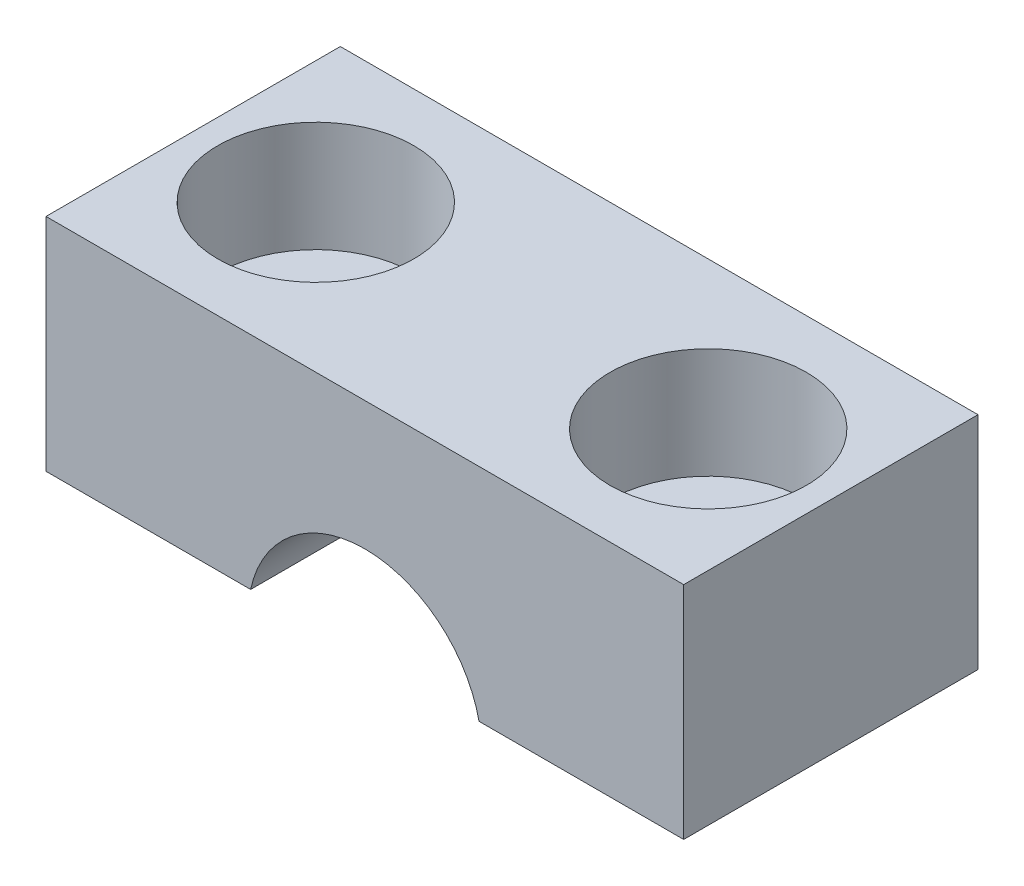
ISO-10303-21;
HEADER;
FILE_DESCRIPTION(('STEP AP214'),'2;1');
FILE_NAME('part.step','',(''),(''),'','','');
FILE_SCHEMA(('AUTOMOTIVE_DESIGN { 1 0 10303 214 1 1 1 1 }'));
ENDSEC;
DATA;
#1=APPLICATION_CONTEXT('core data for automotive mechanical design processes');
#2=APPLICATION_PROTOCOL_DEFINITION('international standard','automotive_design',2000,#1);
#3=PRODUCT_CONTEXT('',#1,'mechanical');
#4=PRODUCT('Part','Part','',(#3));
#5=PRODUCT_RELATED_PRODUCT_CATEGORY('part','',(#4));
#6=PRODUCT_DEFINITION_FORMATION('','',#4);
#7=PRODUCT_DEFINITION_CONTEXT('part definition',#1,'design');
#8=PRODUCT_DEFINITION('design','',#6,#7);
#9=PRODUCT_DEFINITION_SHAPE('','',#8);
#10=(LENGTH_UNIT() NAMED_UNIT(*) SI_UNIT(.MILLI.,.METRE.));
#11=(NAMED_UNIT(*) PLANE_ANGLE_UNIT() SI_UNIT($,.RADIAN.));
#12=(NAMED_UNIT(*) SI_UNIT($,.STERADIAN.) SOLID_ANGLE_UNIT());
#13=UNCERTAINTY_MEASURE_WITH_UNIT(LENGTH_MEASURE(1.E-05),#10,'distance_accuracy_value','');
#14=(GEOMETRIC_REPRESENTATION_CONTEXT(3) GLOBAL_UNCERTAINTY_ASSIGNED_CONTEXT((#13)) GLOBAL_UNIT_ASSIGNED_CONTEXT((#10,
#11,#12)) REPRESENTATION_CONTEXT('',''));
#15=CARTESIAN_POINT('',(0.,0.,0.));
#16=DIRECTION('',(0.,0.,1.));
#17=DIRECTION('',(1.,0.,0.));
#18=AXIS2_PLACEMENT_3D('',#15,#16,#17);
#19=CARTESIAN_POINT('',(0.,26.,0.));
#20=DIRECTION('',(0.,1.,0.));
#21=DIRECTION('',(0.,0.,1.));
#22=AXIS2_PLACEMENT_3D('',#19,#20,#21);
#23=PLANE('',#22);
#24=CARTESIAN_POINT('',(8.,26.,0.));
#25=DIRECTION('',(0.,1.,0.));
#26=DIRECTION('',(0.,0.,1.));
#27=AXIS2_PLACEMENT_3D('',#24,#25,#26);
#28=CIRCLE('',#27,2.25000000000001);
#29=CARTESIAN_POINT('',(8.,26.,2.25000000000001));
#30=VERTEX_POINT('',#29);
#31=EDGE_CURVE('E142',#30,#30,#28,.T.);
#32=ORIENTED_EDGE('',*,*,#31,.T.);
#33=EDGE_LOOP('',(#32));
#34=FACE_BOUND('',#33,.T.);
#35=DIRECTION('',(1.,0.,0.));
#36=VECTOR('',#35,1.);
#37=CARTESIAN_POINT('',(-13.,26.,6.));
#38=LINE('',#37,#36);
#39=CARTESIAN_POINT('',(4.65632969730452,26.,6.));
#40=VERTEX_POINT('',#39);
#41=CARTESIAN_POINT('',(13.,26.,6.));
#42=VERTEX_POINT('',#41);
#43=EDGE_CURVE('E57',#40,#42,#38,.T.);
#44=ORIENTED_EDGE('',*,*,#43,.F.);
#45=DIRECTION('',(0.,0.,-1.));
#46=VECTOR('',#45,1.);
#47=CARTESIAN_POINT('',(4.65632969730452,26.,6.));
#48=LINE('',#47,#46);
#49=CARTESIAN_POINT('',(4.65632969730452,26.,-6.));
#50=VERTEX_POINT('',#49);
#51=EDGE_CURVE('E91',#40,#50,#48,.T.);
#52=ORIENTED_EDGE('',*,*,#51,.T.);
#53=DIRECTION('',(-1.,0.,0.));
#54=VECTOR('',#53,1.);
#55=CARTESIAN_POINT('',(13.,26.,-6.));
#56=LINE('',#55,#54);
#57=CARTESIAN_POINT('',(13.,26.,-6.));
#58=VERTEX_POINT('',#57);
#59=EDGE_CURVE('E109',#58,#50,#56,.T.);
#60=ORIENTED_EDGE('',*,*,#59,.F.);
#61=DIRECTION('',(0.,0.,-1.));
#62=VECTOR('',#61,1.);
#63=CARTESIAN_POINT('',(13.,26.,6.));
#64=LINE('',#63,#62);
#65=EDGE_CURVE('E105',#42,#58,#64,.T.);
#66=ORIENTED_EDGE('',*,*,#65,.F.);
#67=EDGE_LOOP('',(#44,#52,#60,#66));
#68=FACE_BOUND('',#67,.T.);
#69=ADVANCED_FACE('F33',(#34,#68),#23,.F.);
#70=CARTESIAN_POINT('',(13.,26.,6.));
#71=DIRECTION('',(1.,0.,0.));
#72=DIRECTION('',(0.,0.,-1.));
#73=AXIS2_PLACEMENT_3D('',#70,#71,#72);
#74=PLANE('',#73);
#75=DIRECTION('',(0.,0.,-1.));
#76=VECTOR('',#75,1.);
#77=CARTESIAN_POINT('',(13.,35.,6.));
#78=LINE('',#77,#76);
#79=CARTESIAN_POINT('',(13.,35.,6.));
#80=VERTEX_POINT('',#79);
#81=CARTESIAN_POINT('',(13.,35.,-6.));
#82=VERTEX_POINT('',#81);
#83=EDGE_CURVE('E113',#80,#82,#78,.T.);
#84=ORIENTED_EDGE('',*,*,#83,.F.);
#85=DIRECTION('',(0.,1.,0.));
#86=VECTOR('',#85,1.);
#87=CARTESIAN_POINT('',(13.,26.,6.));
#88=LINE('',#87,#86);
#89=EDGE_CURVE('E11',#42,#80,#88,.T.);
#90=ORIENTED_EDGE('',*,*,#89,.F.);
#91=ORIENTED_EDGE('',*,*,#65,.T.);
#92=DIRECTION('',(0.,1.,0.));
#93=VECTOR('',#92,1.);
#94=CARTESIAN_POINT('',(13.,26.,-6.));
#95=LINE('',#94,#93);
#96=EDGE_CURVE('E37',#58,#82,#95,.T.);
#97=ORIENTED_EDGE('',*,*,#96,.T.);
#98=EDGE_LOOP('',(#84,#90,#91,#97));
#99=FACE_BOUND('',#98,.T.);
#100=ADVANCED_FACE('F35',(#99),#74,.T.);
#101=CARTESIAN_POINT('',(-13.,26.,6.));
#102=DIRECTION('',(0.,0.,1.));
#103=DIRECTION('',(1.,0.,0.));
#104=AXIS2_PLACEMENT_3D('',#101,#102,#103);
#105=PLANE('',#104);
#106=CARTESIAN_POINT('',(0.,25.,6.));
#107=DIRECTION('',(0.,0.,-1.));
#108=DIRECTION('',(-1.,0.,0.));
#109=AXIS2_PLACEMENT_3D('',#106,#107,#108);
#110=CIRCLE('',#109,4.7625);
#111=CARTESIAN_POINT('',(-4.65632969730452,26.,6.));
#112=VERTEX_POINT('',#111);
#113=EDGE_CURVE('E50',#112,#40,#110,.T.);
#114=ORIENTED_EDGE('',*,*,#113,.T.);
#115=ORIENTED_EDGE('',*,*,#43,.T.);
#116=ORIENTED_EDGE('',*,*,#89,.T.);
#117=DIRECTION('',(1.,0.,0.));
#118=VECTOR('',#117,1.);
#119=CARTESIAN_POINT('',(-13.,35.,6.));
#120=LINE('',#119,#118);
#121=CARTESIAN_POINT('',(-13.,35.,6.));
#122=VERTEX_POINT('',#121);
#123=EDGE_CURVE('E122',#122,#80,#120,.T.);
#124=ORIENTED_EDGE('',*,*,#123,.F.);
#125=DIRECTION('',(0.,1.,0.));
#126=VECTOR('',#125,1.);
#127=CARTESIAN_POINT('',(-13.,26.,6.));
#128=LINE('',#127,#126);
#129=CARTESIAN_POINT('',(-13.,26.,6.));
#130=VERTEX_POINT('',#129);
#131=EDGE_CURVE('E42',#130,#122,#128,.T.);
#132=ORIENTED_EDGE('',*,*,#131,.F.);
#133=EDGE_CURVE('E101',#130,#112,#38,.T.);
#134=ORIENTED_EDGE('',*,*,#133,.T.);
#135=EDGE_LOOP('',(#114,#115,#116,#124,#132,#134));
#136=FACE_BOUND('',#135,.T.);
#137=ADVANCED_FACE('F99',(#136),#105,.T.);
#138=CARTESIAN_POINT('',(-13.,26.,-6.));
#139=DIRECTION('',(-1.,0.,0.));
#140=DIRECTION('',(0.,0.,1.));
#141=AXIS2_PLACEMENT_3D('',#138,#139,#140);
#142=PLANE('',#141);
#143=DIRECTION('',(0.,0.,1.));
#144=VECTOR('',#143,1.);
#145=CARTESIAN_POINT('',(-13.,35.,-6.));
#146=LINE('',#145,#144);
#147=CARTESIAN_POINT('',(-13.,35.,-6.));
#148=VERTEX_POINT('',#147);
#149=EDGE_CURVE('E119',#148,#122,#146,.T.);
#150=ORIENTED_EDGE('',*,*,#149,.F.);
#151=DIRECTION('',(0.,1.,0.));
#152=VECTOR('',#151,1.);
#153=CARTESIAN_POINT('',(-13.,26.,-6.));
#154=LINE('',#153,#152);
#155=CARTESIAN_POINT('',(-13.,26.,-6.));
#156=VERTEX_POINT('',#155);
#157=EDGE_CURVE('E125',#156,#148,#154,.T.);
#158=ORIENTED_EDGE('',*,*,#157,.F.);
#159=DIRECTION('',(0.,0.,1.));
#160=VECTOR('',#159,1.);
#161=CARTESIAN_POINT('',(-13.,26.,-6.));
#162=LINE('',#161,#160);
#163=EDGE_CURVE('E106',#156,#130,#162,.T.);
#164=ORIENTED_EDGE('',*,*,#163,.T.);
#165=ORIENTED_EDGE('',*,*,#131,.T.);
#166=EDGE_LOOP('',(#150,#158,#164,#165));
#167=FACE_BOUND('',#166,.T.);
#168=ADVANCED_FACE('F134',(#167),#142,.T.);
#169=CARTESIAN_POINT('',(13.,26.,-6.));
#170=DIRECTION('',(0.,0.,-1.));
#171=DIRECTION('',(-1.,0.,0.));
#172=AXIS2_PLACEMENT_3D('',#169,#170,#171);
#173=PLANE('',#172);
#174=CARTESIAN_POINT('',(0.,25.,-6.));
#175=DIRECTION('',(0.,0.,-1.));
#176=DIRECTION('',(-1.,0.,0.));
#177=AXIS2_PLACEMENT_3D('',#174,#175,#176);
#178=CIRCLE('',#177,4.7625);
#179=CARTESIAN_POINT('',(-4.65632969730452,26.,-6.));
#180=VERTEX_POINT('',#179);
#181=EDGE_CURVE('E94',#180,#50,#178,.T.);
#182=ORIENTED_EDGE('',*,*,#181,.F.);
#183=EDGE_CURVE('E138',#180,#156,#56,.T.);
#184=ORIENTED_EDGE('',*,*,#183,.T.);
#185=ORIENTED_EDGE('',*,*,#157,.T.);
#186=DIRECTION('',(-1.,0.,0.));
#187=VECTOR('',#186,1.);
#188=CARTESIAN_POINT('',(13.,35.,-6.));
#189=LINE('',#188,#187);
#190=EDGE_CURVE('E116',#82,#148,#189,.T.);
#191=ORIENTED_EDGE('',*,*,#190,.F.);
#192=ORIENTED_EDGE('',*,*,#96,.F.);
#193=ORIENTED_EDGE('',*,*,#59,.T.);
#194=EDGE_LOOP('',(#182,#184,#185,#191,#192,#193));
#195=FACE_BOUND('',#194,.T.);
#196=ADVANCED_FACE('F129',(#195),#173,.T.);
#197=CARTESIAN_POINT('',(-8.,26.,0.));
#198=DIRECTION('',(0.,1.,0.));
#199=DIRECTION('',(0.,0.,1.));
#200=AXIS2_PLACEMENT_3D('',#197,#198,#199);
#201=CIRCLE('',#200,2.25000000000001);
#202=CARTESIAN_POINT('',(-8.,26.,2.25000000000001));
#203=VERTEX_POINT('',#202);
#204=EDGE_CURVE('E157',#203,#203,#201,.T.);
#205=ORIENTED_EDGE('',*,*,#204,.T.);
#206=EDGE_LOOP('',(#205));
#207=FACE_BOUND('',#206,.T.);
#208=ORIENTED_EDGE('',*,*,#183,.F.);
#209=DIRECTION('',(0.,0.,-1.));
#210=VECTOR('',#209,1.);
#211=CARTESIAN_POINT('',(-4.65632969730452,26.,6.));
#212=LINE('',#211,#210);
#213=EDGE_CURVE('E96',#112,#180,#212,.T.);
#214=ORIENTED_EDGE('',*,*,#213,.F.);
#215=ORIENTED_EDGE('',*,*,#133,.F.);
#216=ORIENTED_EDGE('',*,*,#163,.F.);
#217=EDGE_LOOP('',(#208,#214,#215,#216));
#218=FACE_BOUND('',#217,.T.);
#219=ADVANCED_FACE('F137',(#207,#218),#23,.F.);
#220=CARTESIAN_POINT('',(0.,35.,0.));
#221=DIRECTION('',(0.,1.,0.));
#222=DIRECTION('',(0.,0.,1.));
#223=AXIS2_PLACEMENT_3D('',#220,#221,#222);
#224=PLANE('',#223);
#225=CARTESIAN_POINT('',(-8.,35.,0.));
#226=DIRECTION('',(0.,1.,0.));
#227=DIRECTION('',(0.,0.,1.));
#228=AXIS2_PLACEMENT_3D('',#225,#226,#227);
#229=CIRCLE('',#228,3.99999999999999);
#230=CARTESIAN_POINT('',(-8.,35.,3.99999999999999));
#231=VERTEX_POINT('',#230);
#232=EDGE_CURVE('E166',#231,#231,#229,.T.);
#233=ORIENTED_EDGE('',*,*,#232,.F.);
#234=EDGE_LOOP('',(#233));
#235=FACE_BOUND('',#234,.T.);
#236=CARTESIAN_POINT('',(8.,35.,0.));
#237=DIRECTION('',(0.,1.,0.));
#238=DIRECTION('',(0.,0.,1.));
#239=AXIS2_PLACEMENT_3D('',#236,#237,#238);
#240=CIRCLE('',#239,3.99999999999999);
#241=CARTESIAN_POINT('',(8.,35.,3.99999999999999));
#242=VERTEX_POINT('',#241);
#243=EDGE_CURVE('E154',#242,#242,#240,.T.);
#244=ORIENTED_EDGE('',*,*,#243,.F.);
#245=EDGE_LOOP('',(#244));
#246=FACE_BOUND('',#245,.T.);
#247=ORIENTED_EDGE('',*,*,#83,.T.);
#248=ORIENTED_EDGE('',*,*,#190,.T.);
#249=ORIENTED_EDGE('',*,*,#149,.T.);
#250=ORIENTED_EDGE('',*,*,#123,.T.);
#251=EDGE_LOOP('',(#247,#248,#249,#250));
#252=FACE_BOUND('',#251,.T.);
#253=ADVANCED_FACE('F131',(#235,#246,#252),#224,.T.);
#254=CARTESIAN_POINT('',(0.,25.,6.));
#255=DIRECTION('',(0.,0.,-1.));
#256=DIRECTION('',(-1.,0.,0.));
#257=AXIS2_PLACEMENT_3D('',#254,#255,#256);
#258=CYLINDRICAL_SURFACE('',#257,4.7625);
#259=ORIENTED_EDGE('',*,*,#181,.T.);
#260=ORIENTED_EDGE('',*,*,#51,.F.);
#261=ORIENTED_EDGE('',*,*,#113,.F.);
#262=ORIENTED_EDGE('',*,*,#213,.T.);
#263=EDGE_LOOP('',(#259,#260,#261,#262));
#264=FACE_BOUND('',#263,.T.);
#265=ADVANCED_FACE('F92',(#264),#258,.F.);
#266=CARTESIAN_POINT('',(8.,35.,0.));
#267=DIRECTION('',(0.,1.,0.));
#268=DIRECTION('',(0.,0.,1.));
#269=AXIS2_PLACEMENT_3D('',#266,#267,#268);
#270=CYLINDRICAL_SURFACE('',#269,2.25000000000001);
#271=ORIENTED_EDGE('',*,*,#31,.F.);
#272=EDGE_LOOP('',(#271));
#273=FACE_BOUND('',#272,.T.);
#274=CARTESIAN_POINT('',(8.,30.5,0.));
#275=DIRECTION('',(0.,1.,0.));
#276=DIRECTION('',(0.,0.,1.));
#277=AXIS2_PLACEMENT_3D('',#274,#275,#276);
#278=CIRCLE('',#277,2.25000000000001);
#279=CARTESIAN_POINT('',(8.,30.5,2.25000000000001));
#280=VERTEX_POINT('',#279);
#281=EDGE_CURVE('E144',#280,#280,#278,.T.);
#282=ORIENTED_EDGE('',*,*,#281,.T.);
#283=EDGE_LOOP('',(#282));
#284=FACE_BOUND('',#283,.T.);
#285=ADVANCED_FACE('F190',(#273,#284),#270,.F.);
#286=CARTESIAN_POINT('',(10.25,30.5,0.));
#287=DIRECTION('',(0.,-1.,0.));
#288=DIRECTION('',(0.,0.,-1.));
#289=AXIS2_PLACEMENT_3D('',#286,#287,#288);
#290=PLANE('',#289);
#291=ORIENTED_EDGE('',*,*,#281,.F.);
#292=EDGE_LOOP('',(#291));
#293=FACE_BOUND('',#292,.T.);
#294=CARTESIAN_POINT('',(8.,30.5,0.));
#295=DIRECTION('',(0.,1.,0.));
#296=DIRECTION('',(0.,0.,1.));
#297=AXIS2_PLACEMENT_3D('',#294,#295,#296);
#298=CIRCLE('',#297,3.99999999999999);
#299=CARTESIAN_POINT('',(8.,30.5,3.99999999999999));
#300=VERTEX_POINT('',#299);
#301=EDGE_CURVE('E149',#300,#300,#298,.T.);
#302=ORIENTED_EDGE('',*,*,#301,.T.);
#303=EDGE_LOOP('',(#302));
#304=FACE_BOUND('',#303,.T.);
#305=ADVANCED_FACE('F180',(#293,#304),#290,.F.);
#306=CARTESIAN_POINT('',(8.,35.,0.));
#307=DIRECTION('',(0.,1.,0.));
#308=DIRECTION('',(0.,0.,1.));
#309=AXIS2_PLACEMENT_3D('',#306,#307,#308);
#310=CYLINDRICAL_SURFACE('',#309,3.99999999999999);
#311=ORIENTED_EDGE('',*,*,#301,.F.);
#312=EDGE_LOOP('',(#311));
#313=FACE_BOUND('',#312,.T.);
#314=ORIENTED_EDGE('',*,*,#243,.T.);
#315=EDGE_LOOP('',(#314));
#316=FACE_BOUND('',#315,.T.);
#317=ADVANCED_FACE('F177',(#313,#316),#310,.F.);
#318=CARTESIAN_POINT('',(-8.,35.,0.));
#319=DIRECTION('',(0.,1.,0.));
#320=DIRECTION('',(0.,0.,1.));
#321=AXIS2_PLACEMENT_3D('',#318,#319,#320);
#322=CYLINDRICAL_SURFACE('',#321,2.25000000000001);
#323=ORIENTED_EDGE('',*,*,#204,.F.);
#324=EDGE_LOOP('',(#323));
#325=FACE_BOUND('',#324,.T.);
#326=CARTESIAN_POINT('',(-8.,30.5,0.));
#327=DIRECTION('',(0.,1.,0.));
#328=DIRECTION('',(0.,0.,1.));
#329=AXIS2_PLACEMENT_3D('',#326,#327,#328);
#330=CIRCLE('',#329,2.25000000000001);
#331=CARTESIAN_POINT('',(-8.,30.5,2.25000000000001));
#332=VERTEX_POINT('',#331);
#333=EDGE_CURVE('E160',#332,#332,#330,.T.);
#334=ORIENTED_EDGE('',*,*,#333,.T.);
#335=EDGE_LOOP('',(#334));
#336=FACE_BOUND('',#335,.T.);
#337=ADVANCED_FACE('F179',(#325,#336),#322,.F.);
#338=CARTESIAN_POINT('',(-5.74999999999999,30.5,0.));
#339=DIRECTION('',(0.,-1.,0.));
#340=DIRECTION('',(0.,0.,-1.));
#341=AXIS2_PLACEMENT_3D('',#338,#339,#340);
#342=PLANE('',#341);
#343=ORIENTED_EDGE('',*,*,#333,.F.);
#344=EDGE_LOOP('',(#343));
#345=FACE_BOUND('',#344,.T.);
#346=CARTESIAN_POINT('',(-8.,30.5,0.));
#347=DIRECTION('',(0.,1.,0.));
#348=DIRECTION('',(0.,0.,1.));
#349=AXIS2_PLACEMENT_3D('',#346,#347,#348);
#350=CIRCLE('',#349,3.99999999999999);
#351=CARTESIAN_POINT('',(-8.,30.5,3.99999999999999));
#352=VERTEX_POINT('',#351);
#353=EDGE_CURVE('E163',#352,#352,#350,.T.);
#354=ORIENTED_EDGE('',*,*,#353,.T.);
#355=EDGE_LOOP('',(#354));
#356=FACE_BOUND('',#355,.T.);
#357=ADVANCED_FACE('F187',(#345,#356),#342,.F.);
#358=CARTESIAN_POINT('',(-8.,35.,0.));
#359=DIRECTION('',(0.,1.,0.));
#360=DIRECTION('',(0.,0.,1.));
#361=AXIS2_PLACEMENT_3D('',#358,#359,#360);
#362=CYLINDRICAL_SURFACE('',#361,3.99999999999999);
#363=ORIENTED_EDGE('',*,*,#353,.F.);
#364=EDGE_LOOP('',(#363));
#365=FACE_BOUND('',#364,.T.);
#366=ORIENTED_EDGE('',*,*,#232,.T.);
#367=EDGE_LOOP('',(#366));
#368=FACE_BOUND('',#367,.T.);
#369=ADVANCED_FACE('F170',(#365,#368),#362,.F.);
#370=CLOSED_SHELL('',(#69,#100,#137,#168,#196,#219,#253,#265,#285,#305,#317,#337,#357,#369));
#371=MANIFOLD_SOLID_BREP('B2',#370);
#372=ADVANCED_BREP_SHAPE_REPRESENTATION('',(#18,#371),#14);
#373=SHAPE_DEFINITION_REPRESENTATION(#9,#372);
ENDSEC;
END-ISO-10303-21;
